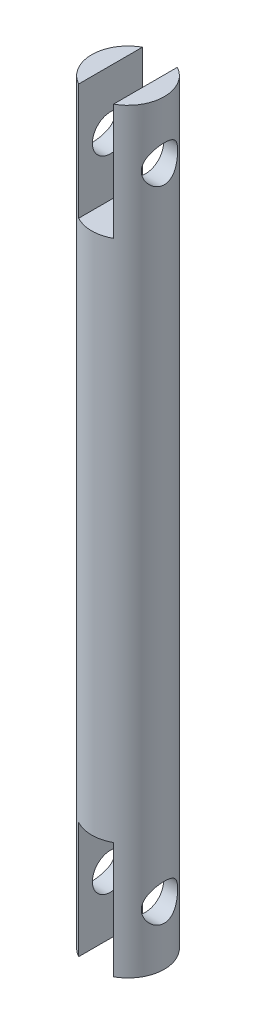
ISO-10303-21;
HEADER;
FILE_DESCRIPTION(('STEP AP214'),'2;1');
FILE_NAME('part.step','',(''),(''),'','','');
FILE_SCHEMA(('AUTOMOTIVE_DESIGN { 1 0 10303 214 1 1 1 1 }'));
ENDSEC;
DATA;
#1=APPLICATION_CONTEXT('core data for automotive mechanical design processes');
#2=APPLICATION_PROTOCOL_DEFINITION('international standard','automotive_design',2000,#1);
#3=PRODUCT_CONTEXT('',#1,'mechanical');
#4=PRODUCT('Part','Part','',(#3));
#5=PRODUCT_RELATED_PRODUCT_CATEGORY('part','',(#4));
#6=PRODUCT_DEFINITION_FORMATION('','',#4);
#7=PRODUCT_DEFINITION_CONTEXT('part definition',#1,'design');
#8=PRODUCT_DEFINITION('design','',#6,#7);
#9=PRODUCT_DEFINITION_SHAPE('','',#8);
#10=(LENGTH_UNIT() NAMED_UNIT(*) SI_UNIT(.MILLI.,.METRE.));
#11=(NAMED_UNIT(*) PLANE_ANGLE_UNIT() SI_UNIT($,.RADIAN.));
#12=(NAMED_UNIT(*) SI_UNIT($,.STERADIAN.) SOLID_ANGLE_UNIT());
#13=UNCERTAINTY_MEASURE_WITH_UNIT(LENGTH_MEASURE(1.E-05),#10,'distance_accuracy_value','');
#14=(GEOMETRIC_REPRESENTATION_CONTEXT(3) GLOBAL_UNCERTAINTY_ASSIGNED_CONTEXT((#13)) GLOBAL_UNIT_ASSIGNED_CONTEXT((#10,
#11,#12)) REPRESENTATION_CONTEXT('',''));
#15=CARTESIAN_POINT('',(0.,0.,0.));
#16=DIRECTION('',(0.,0.,1.));
#17=DIRECTION('',(1.,0.,0.));
#18=AXIS2_PLACEMENT_3D('',#15,#16,#17);
#19=CARTESIAN_POINT('',(0.,52.,0.));
#20=DIRECTION('',(0.,1.,0.));
#21=DIRECTION('',(0.,0.,1.));
#22=AXIS2_PLACEMENT_3D('',#19,#20,#21);
#23=PLANE('',#22);
#24=DIRECTION('',(0.,0.,1.));
#25=VECTOR('',#24,1.);
#26=CARTESIAN_POINT('',(-1.2,52.,-2.5));
#27=LINE('',#26,#25);
#28=CARTESIAN_POINT('',(-1.2,52.,-2.19317121994613));
#29=VERTEX_POINT('',#28);
#30=CARTESIAN_POINT('',(-1.2,52.,2.19317121994613));
#31=VERTEX_POINT('',#30);
#32=EDGE_CURVE('E122',#29,#31,#27,.T.);
#33=ORIENTED_EDGE('',*,*,#32,.F.);
#34=CARTESIAN_POINT('',(0.,52.,0.));
#35=DIRECTION('',(0.,1.,0.));
#36=DIRECTION('',(0.,0.,1.));
#37=AXIS2_PLACEMENT_3D('',#34,#35,#36);
#38=CIRCLE('',#37,2.5);
#39=EDGE_CURVE('E134',#29,#31,#38,.T.);
#40=ORIENTED_EDGE('',*,*,#39,.T.);
#41=EDGE_LOOP('',(#33,#40));
#42=FACE_BOUND('',#41,.T.);
#43=ADVANCED_FACE('F45',(#42),#23,.T.);
#44=CARTESIAN_POINT('',(-2.5,48.,0.));
#45=DIRECTION('',(1.,0.,0.));
#46=DIRECTION('',(0.,0.,-1.));
#47=AXIS2_PLACEMENT_3D('',#44,#45,#46);
#48=CYLINDRICAL_SURFACE('',#47,1.25);
#49=CARTESIAN_POINT('',(-1.2,48.,0.));
#50=DIRECTION('',(-1.,0.,0.));
#51=DIRECTION('',(0.,0.,1.));
#52=AXIS2_PLACEMENT_3D('',#49,#50,#51);
#53=CIRCLE('',#52,1.25);
#54=CARTESIAN_POINT('',(-1.2,48.,1.25));
#55=VERTEX_POINT('',#54);
#56=EDGE_CURVE('E227',#55,#55,#53,.F.);
#57=ORIENTED_EDGE('',*,*,#56,.T.);
#58=EDGE_LOOP('',(#57));
#59=FACE_BOUND('',#58,.T.);
#60=CARTESIAN_POINT('',(-2.5,46.75,0.));
#61=CARTESIAN_POINT('',(-2.49999641755189,46.7500041278994,-0.0657149536912329));
#62=CARTESIAN_POINT('',(-2.49738113774397,46.7552125914021,-0.131508249622541));
#63=CARTESIAN_POINT('',(-2.48717695046745,46.7758161004261,-0.261150294085531));
#64=CARTESIAN_POINT('',(-2.47957859786229,46.7912304912471,-0.324995108391879));
#65=CARTESIAN_POINT('',(-2.46020349254139,46.831492260771,-0.448666931100718));
#66=CARTESIAN_POINT('',(-2.448442989719,46.85630298031,-0.508508503673975));
#67=CARTESIAN_POINT('',(-2.42182220644723,46.9144632767062,-0.623090771008206));
#68=CARTESIAN_POINT('',(-2.40696217041913,46.9478121803111,-0.677831867487562));
#69=CARTESIAN_POINT('',(-2.37445322822571,47.0243965618566,-0.784384772202396));
#70=CARTESIAN_POINT('',(-2.3566899890942,47.0681080990496,-0.835819013902634));
#71=CARTESIAN_POINT('',(-2.32074962808431,47.1631518490588,-0.930974306083716));
#72=CARTESIAN_POINT('',(-2.30257220261294,47.2144898147155,-0.974689478883455));
#73=CARTESIAN_POINT('',(-2.26623688996684,47.3281041869042,-1.05656500056285));
#74=CARTESIAN_POINT('',(-2.24818983712665,47.3909201229324,-1.09403166943955));
#75=CARTESIAN_POINT('',(-2.21607473465401,47.5229591699828,-1.15771028361337));
#76=CARTESIAN_POINT('',(-2.20200384508737,47.5921776609034,-1.18393026870792));
#77=CARTESIAN_POINT('',(-2.18072333797261,47.7308313817774,-1.22266555273573));
#78=CARTESIAN_POINT('',(-2.17315339479642,47.8000055650842,-1.23590732135055));
#79=CARTESIAN_POINT('',(-2.1647736243566,47.9399735472244,-1.25053374163606));
#80=CARTESIAN_POINT('',(-2.1639571167911,48.0107656760889,-1.25193011046634));
#81=CARTESIAN_POINT('',(-2.16888662821561,48.1428575303942,-1.24335910896537));
#82=CARTESIAN_POINT('',(-2.17385954577517,48.2042800390288,-1.23473069942102));
#83=CARTESIAN_POINT('',(-2.18845285917313,48.3246523867163,-1.20867481132116));
#84=CARTESIAN_POINT('',(-2.1980747353972,48.3836014316316,-1.19124452987206));
#85=CARTESIAN_POINT('',(-2.22109345515926,48.4990364157071,-1.1477622254825));
#86=CARTESIAN_POINT('',(-2.23457300829998,48.5554329984822,-1.12151883389499));
#87=CARTESIAN_POINT('',(-2.26379255351755,48.6632928657375,-1.061302109585));
#88=CARTESIAN_POINT('',(-2.27953355975238,48.7147539195001,-1.02732530476558));
#89=CARTESIAN_POINT('',(-2.31391447379107,48.818151565929,-0.947582568640984));
#90=CARTESIAN_POINT('',(-2.33266887795933,48.8693210919702,-0.9008680729616));
#91=CARTESIAN_POINT('',(-2.36934529125509,48.9634192732386,-0.799444473426714));
#92=CARTESIAN_POINT('',(-2.38726689948501,49.0063439900424,-0.744731570717854));
#93=CARTESIAN_POINT('',(-2.42127484103705,49.0846070762872,-0.625645632289809));
#94=CARTESIAN_POINT('',(-2.43723730202509,49.1195005905572,-0.56094198949926));
#95=CARTESIAN_POINT('',(-2.46447351401553,49.1776212863038,-0.425582769360996));
#96=CARTESIAN_POINT('',(-2.47575098679441,49.200857731269,-0.354931970331595));
#97=CARTESIAN_POINT('',(-2.49155417176795,49.2330942546458,-0.215958114575876));
#98=CARTESIAN_POINT('',(-2.4965617287664,49.2431140446835,-0.147926913185405));
#99=CARTESIAN_POINT('',(-2.50091266823877,49.2518309139181,-0.0109744999366913));
#100=CARTESIAN_POINT('',(-2.5002587340164,49.2505333570493,0.0579462748373776));
#101=CARTESIAN_POINT('',(-2.49363990316801,49.2372416394766,0.189041214982493));
#102=CARTESIAN_POINT('',(-2.48809057110237,49.2260843340875,0.251324260062444));
#103=CARTESIAN_POINT('',(-2.47277714143524,49.1947024101311,0.373008615377397));
#104=CARTESIAN_POINT('',(-2.46301257917916,49.1744767919333,0.432409607113746));
#105=CARTESIAN_POINT('',(-2.43980314267087,49.1250019169585,0.548610760562083));
#106=CARTESIAN_POINT('',(-2.42626102212424,49.095511187354,0.605287996257694));
#107=CARTESIAN_POINT('',(-2.39679967896386,49.0286155804424,0.713076702123653));
#108=CARTESIAN_POINT('',(-2.38087944457231,48.9912073317582,0.764185787219102));
#109=CARTESIAN_POINT('',(-2.34635276671831,48.9052994683339,0.864709611613315));
#110=CARTESIAN_POINT('',(-2.32763606060552,48.856071414433,0.913465097280797));
#111=CARTESIAN_POINT('',(-2.29077989504843,48.7500935609134,1.00232040139155));
#112=CARTESIAN_POINT('',(-2.27264084226908,48.6933386014795,1.04241423211355));
#113=CARTESIAN_POINT('',(-2.23813990282585,48.5704454322496,1.11463489312212));
#114=CARTESIAN_POINT('',(-2.2219066207934,48.5039859172393,1.14628186984829));
#115=CARTESIAN_POINT('',(-2.19467590460158,48.3656124153843,1.19760353251725));
#116=CARTESIAN_POINT('',(-2.18367172800773,48.2937055918735,1.21729364485946));
#117=CARTESIAN_POINT('',(-2.16951876260834,48.1538622214232,1.2423271093121));
#118=CARTESIAN_POINT('',(-2.16571729325614,48.0862071832137,1.24886624550108));
#119=CARTESIAN_POINT('',(-2.16456693307719,47.9506911660366,1.25086144297598));
#120=CARTESIAN_POINT('',(-2.16721524534441,47.8828302890757,1.2463223082805));
#121=CARTESIAN_POINT('',(-2.17797327562531,47.755645623085,1.22740765699033));
#122=CARTESIAN_POINT('',(-2.18553868102992,47.6961244123195,1.2140103929285));
#123=CARTESIAN_POINT('',(-2.20463770234897,47.5802398507191,1.1789691977808));
#124=CARTESIAN_POINT('',(-2.21617259462095,47.523877522385,1.15732261394976));
#125=CARTESIAN_POINT('',(-2.2428566295566,47.4117189362667,1.10476968162585));
#126=CARTESIAN_POINT('',(-2.25819652995238,47.3562151227129,1.07333892227057));
#127=CARTESIAN_POINT('',(-2.29044164543238,47.2509068297743,1.00268871454579));
#128=CARTESIAN_POINT('',(-2.30734767243153,47.2011053368519,0.963465214048306));
#129=CARTESIAN_POINT('',(-2.34327903949141,47.102322522053,0.872754158330797));
#130=CARTESIAN_POINT('',(-2.36231229139336,47.0541761220476,0.820355528762708));
#131=CARTESIAN_POINT('',(-2.3984719031886,46.9671712707205,0.707693507775343));
#132=CARTESIAN_POINT('',(-2.4155972326005,46.9283178257171,0.647425904070976));
#133=CARTESIAN_POINT('',(-2.44622511981379,46.8609545465472,0.519914496024928));
#134=CARTESIAN_POINT('',(-2.45970120703636,46.8325197882357,0.452624379918262));
#135=CARTESIAN_POINT('',(-2.48126676704332,46.7877397901013,0.313427626617734));
#136=CARTESIAN_POINT('',(-2.48937154216165,46.771360191463,0.241534749528954));
#137=CARTESIAN_POINT('',(-2.49619327387079,46.7576282361552,0.140752433104227));
#138=CARTESIAN_POINT('',(-2.49761706674002,46.7547716989205,0.112702349299371));
#139=CARTESIAN_POINT('',(-2.49952121222331,46.750956668104,0.0564396647589457));
#140=CARTESIAN_POINT('',(-2.50000153879704,46.749998226911,0.0282270595592261));
#141=CARTESIAN_POINT('',(-2.5,46.75,0.));
#142=B_SPLINE_CURVE_WITH_KNOTS('',3,(#60,#61,#62,#63,#64,#65,#66,#67,#68,#69,#70,#71,#72,#73,
#74,#75,#76,#77,#78,#79,#80,#81,#82,#83,#84,#85,#86,#87,#88,#89,#90,#91,#92,#93,#94,#95,#96,#97,
#98,#99,#100,#101,#102,#103,#104,#105,#106,#107,#108,#109,#110,#111,#112,#113,#114,#115,#116,
#117,#118,#119,#120,#121,#122,#123,#124,#125,#126,#127,#128,#129,#130,#131,#132,#133,#134,#135,
#136,#137,#138,#139,#140,#141),.UNSPECIFIED.,.T.,.F.,(4,2,2,2,2,2,2,2,2,2,2,2,2,2,2,2,2,2,2,2,2,
2,2,2,2,2,2,2,2,2,2,2,2,2,2,2,2,2,2,2,4),(0.,0.197030321775365,0.394435187136497,
0.591077694365375,0.787704700726956,0.9962271983976,1.20490779706754,1.42977158038441,
1.65447434872851,1.86572515175287,2.07676696661275,2.2625714051165,2.44843504907097,
2.63862800210609,2.82890651575277,3.04331176667347,3.25781918248357,3.4822877776805,
3.70657771140349,3.91229113089181,4.11790705639344,4.30758633132651,4.49728652038664,
4.69241070034873,4.88761813435423,5.10199513305522,5.31651985769288,5.54143352699591,
5.76605639925971,5.96911634372966,6.17208824825005,6.35572412805227,6.53941910979597,
6.73545570969517,6.93159451423696,7.15156553440622,7.37165479220715,7.59330017078655,
7.81431135781161,7.8989410017212,7.98357298143557),.UNSPECIFIED.);
#143=CARTESIAN_POINT('',(-2.5,46.75,0.));
#144=VERTEX_POINT('',#143);
#145=EDGE_CURVE('E170',#144,#144,#142,.T.);
#146=ORIENTED_EDGE('',*,*,#145,.F.);
#147=EDGE_LOOP('',(#146));
#148=FACE_BOUND('',#147,.T.);
#149=ADVANCED_FACE('F183',(#59,#148),#48,.F.);
#150=CARTESIAN_POINT('',(0.,52.,0.));
#151=DIRECTION('',(0.,-1.,0.));
#152=DIRECTION('',(0.,0.,-1.));
#153=AXIS2_PLACEMENT_3D('',#150,#151,#152);
#154=CYLINDRICAL_SURFACE('',#153,2.5);
#155=CARTESIAN_POINT('',(0.,44.,0.));
#156=DIRECTION('',(0.,-1.,0.));
#157=DIRECTION('',(0.,0.,-1.));
#158=AXIS2_PLACEMENT_3D('',#155,#156,#157);
#159=CIRCLE('',#158,2.5);
#160=CARTESIAN_POINT('',(1.2,44.,2.19317121994613));
#161=VERTEX_POINT('',#160);
#162=CARTESIAN_POINT('',(-1.2,44.,2.19317121994613));
#163=VERTEX_POINT('',#162);
#164=EDGE_CURVE('E11',#161,#163,#159,.T.);
#165=ORIENTED_EDGE('',*,*,#164,.T.);
#166=DIRECTION('',(0.,-1.,0.));
#167=VECTOR('',#166,1.);
#168=CARTESIAN_POINT('',(-1.2,52.,2.19317121994613));
#169=LINE('',#168,#167);
#170=EDGE_CURVE('E223',#163,#31,#169,.F.);
#171=ORIENTED_EDGE('',*,*,#170,.T.);
#172=ORIENTED_EDGE('',*,*,#39,.F.);
#173=DIRECTION('',(0.,-1.,0.));
#174=VECTOR('',#173,1.);
#175=CARTESIAN_POINT('',(-1.2,52.,-2.19317121994613));
#176=LINE('',#175,#174);
#177=CARTESIAN_POINT('',(-1.2,44.,-2.19317121994613));
#178=VERTEX_POINT('',#177);
#179=EDGE_CURVE('E161',#29,#178,#176,.T.);
#180=ORIENTED_EDGE('',*,*,#179,.T.);
#181=CARTESIAN_POINT('',(1.2,44.,-2.19317121994613));
#182=VERTEX_POINT('',#181);
#183=EDGE_CURVE('E50',#178,#182,#159,.T.);
#184=ORIENTED_EDGE('',*,*,#183,.T.);
#185=DIRECTION('',(0.,-1.,0.));
#186=VECTOR('',#185,1.);
#187=CARTESIAN_POINT('',(1.2,52.,-2.19317121994613));
#188=LINE('',#187,#186);
#189=CARTESIAN_POINT('',(1.2,52.,-2.19317121994613));
#190=VERTEX_POINT('',#189);
#191=EDGE_CURVE('E115',#182,#190,#188,.F.);
#192=ORIENTED_EDGE('',*,*,#191,.T.);
#193=CARTESIAN_POINT('',(1.2,52.,2.19317121994613));
#194=VERTEX_POINT('',#193);
#195=EDGE_CURVE('E126',#194,#190,#38,.T.);
#196=ORIENTED_EDGE('',*,*,#195,.F.);
#197=DIRECTION('',(0.,-1.,0.));
#198=VECTOR('',#197,1.);
#199=CARTESIAN_POINT('',(1.2,52.,2.19317121994613));
#200=LINE('',#199,#198);
#201=EDGE_CURVE('E62',#194,#161,#200,.T.);
#202=ORIENTED_EDGE('',*,*,#201,.T.);
#203=EDGE_LOOP('',(#165,#171,#172,#180,#184,#192,#196,#202));
#204=FACE_BOUND('',#203,.T.);
#205=CARTESIAN_POINT('',(-2.5,2.75,0.));
#206=CARTESIAN_POINT('',(-2.49999641755189,2.75000412789938,-0.0657149536912331));
#207=CARTESIAN_POINT('',(-2.49738113774397,2.75521259140209,-0.131508249622541));
#208=CARTESIAN_POINT('',(-2.48717695046745,2.77581610042615,-0.261150294085532));
#209=CARTESIAN_POINT('',(-2.47957859786229,2.79123049124706,-0.32499510839188));
#210=CARTESIAN_POINT('',(-2.46020349254139,2.83149226077099,-0.448666931100718));
#211=CARTESIAN_POINT('',(-2.448442989719,2.85630298031002,-0.508508503673975));
#212=CARTESIAN_POINT('',(-2.42182220644723,2.91446327670618,-0.623090771008207));
#213=CARTESIAN_POINT('',(-2.40696217041912,2.94781218031107,-0.677831867487563));
#214=CARTESIAN_POINT('',(-2.37445322822571,3.02439656185662,-0.784384772202399));
#215=CARTESIAN_POINT('',(-2.3566899890942,3.06810809904955,-0.835819013902641));
#216=CARTESIAN_POINT('',(-2.3207496280843,3.16315184905879,-0.930974306083722));
#217=CARTESIAN_POINT('',(-2.30257220261294,3.21448981471555,-0.974689478883458));
#218=CARTESIAN_POINT('',(-2.26623688996684,3.32810418690423,-1.05656500056285));
#219=CARTESIAN_POINT('',(-2.24818983712665,3.39092012293239,-1.09403166943955));
#220=CARTESIAN_POINT('',(-2.21607473465401,3.52295916998277,-1.15771028361337));
#221=CARTESIAN_POINT('',(-2.20200384508737,3.59217766090344,-1.18393026870792));
#222=CARTESIAN_POINT('',(-2.18072333797261,3.7308313817774,-1.22266555273573));
#223=CARTESIAN_POINT('',(-2.17315339479642,3.80000556508424,-1.23590732135055));
#224=CARTESIAN_POINT('',(-2.1647736243566,3.93997354722434,-1.25053374163606));
#225=CARTESIAN_POINT('',(-2.1639571167911,4.01076567608894,-1.25193011046634));
#226=CARTESIAN_POINT('',(-2.16888662821561,4.14285753039421,-1.24335910896537));
#227=CARTESIAN_POINT('',(-2.17385954577517,4.20428003902881,-1.23473069942103));
#228=CARTESIAN_POINT('',(-2.18845285917313,4.3246523867163,-1.20867481132117));
#229=CARTESIAN_POINT('',(-2.1980747353972,4.38360143163164,-1.19124452987206));
#230=CARTESIAN_POINT('',(-2.22109345515926,4.49903641570707,-1.1477622254825));
#231=CARTESIAN_POINT('',(-2.23457300829998,4.55543299848223,-1.12151883389499));
#232=CARTESIAN_POINT('',(-2.26379255351755,4.66329286573751,-1.061302109585));
#233=CARTESIAN_POINT('',(-2.27953355975238,4.71475391950011,-1.02732530476558));
#234=CARTESIAN_POINT('',(-2.31391447379107,4.81815156592903,-0.947582568640986));
#235=CARTESIAN_POINT('',(-2.33266887795933,4.8693210919702,-0.900868072961602));
#236=CARTESIAN_POINT('',(-2.36934529125509,4.96341927323863,-0.799444473426716));
#237=CARTESIAN_POINT('',(-2.38726689948501,5.00634399004235,-0.744731570717856));
#238=CARTESIAN_POINT('',(-2.42127484103705,5.08460707628716,-0.625645632289809));
#239=CARTESIAN_POINT('',(-2.43723730202509,5.11950059055718,-0.56094198949926));
#240=CARTESIAN_POINT('',(-2.46447351401553,5.17762128630376,-0.425582769360995));
#241=CARTESIAN_POINT('',(-2.47575098679441,5.20085773126896,-0.354931970331594));
#242=CARTESIAN_POINT('',(-2.49155417176795,5.23309425464584,-0.215958114575876));
#243=CARTESIAN_POINT('',(-2.4965617287664,5.24311404468347,-0.147926913185404));
#244=CARTESIAN_POINT('',(-2.50091266823877,5.25183091391811,-0.0109744999366911));
#245=CARTESIAN_POINT('',(-2.5002587340164,5.25053335704935,0.0579462748373775));
#246=CARTESIAN_POINT('',(-2.49363990316801,5.23724163947656,0.189041214982492));
#247=CARTESIAN_POINT('',(-2.48809057110237,5.22608433408746,0.251324260062443));
#248=CARTESIAN_POINT('',(-2.47277714143524,5.19470241013114,0.373008615377396));
#249=CARTESIAN_POINT('',(-2.46301257917916,5.1744767919333,0.432409607113746));
#250=CARTESIAN_POINT('',(-2.43980314267087,5.12500191695853,0.548610760562081));
#251=CARTESIAN_POINT('',(-2.42626102212424,5.09551118735398,0.605287996257691));
#252=CARTESIAN_POINT('',(-2.39679967896386,5.02861558044245,0.71307670212365));
#253=CARTESIAN_POINT('',(-2.38087944457231,4.99120733175821,0.764185787219102));
#254=CARTESIAN_POINT('',(-2.34635276671831,4.90529946833391,0.864709611613316));
#255=CARTESIAN_POINT('',(-2.32763606060552,4.85607141443304,0.913465097280798));
#256=CARTESIAN_POINT('',(-2.29077989504843,4.75009356091337,1.00232040139155));
#257=CARTESIAN_POINT('',(-2.27264084226908,4.69333860147953,1.04241423211355));
#258=CARTESIAN_POINT('',(-2.23813990282585,4.57044543224961,1.11463489312212));
#259=CARTESIAN_POINT('',(-2.2219066207934,4.50398591723926,1.1462818698483));
#260=CARTESIAN_POINT('',(-2.19467590460158,4.36561241538435,1.19760353251725));
#261=CARTESIAN_POINT('',(-2.18367172800773,4.29370559187352,1.21729364485946));
#262=CARTESIAN_POINT('',(-2.16951876260833,4.15386222142319,1.2423271093121));
#263=CARTESIAN_POINT('',(-2.16571729325614,4.0862071832137,1.24886624550108));
#264=CARTESIAN_POINT('',(-2.16456693307719,3.95069116603659,1.25086144297598));
#265=CARTESIAN_POINT('',(-2.16721524534441,3.88283028907571,1.2463223082805));
#266=CARTESIAN_POINT('',(-2.17797327562531,3.75564562308498,1.22740765699033));
#267=CARTESIAN_POINT('',(-2.18553868102992,3.6961244123195,1.2140103929285));
#268=CARTESIAN_POINT('',(-2.20463770234897,3.58023985071912,1.17896919778081));
#269=CARTESIAN_POINT('',(-2.21617259462095,3.52387752238504,1.15732261394976));
#270=CARTESIAN_POINT('',(-2.2428566295566,3.41171893626674,1.10476968162585));
#271=CARTESIAN_POINT('',(-2.25819652995238,3.35621512271287,1.07333892227057));
#272=CARTESIAN_POINT('',(-2.29044164543238,3.25090682977427,1.00268871454579));
#273=CARTESIAN_POINT('',(-2.30734767243153,3.20110533685189,0.963465214048309));
#274=CARTESIAN_POINT('',(-2.34327903949141,3.10232252205298,0.8727541583308));
#275=CARTESIAN_POINT('',(-2.36231229139336,3.0541761220476,0.820355528762712));
#276=CARTESIAN_POINT('',(-2.3984719031886,2.96717127072046,0.707693507775348));
#277=CARTESIAN_POINT('',(-2.4155972326005,2.92831782571714,0.64742590407098));
#278=CARTESIAN_POINT('',(-2.44622511981379,2.86095454654725,0.519914496024933));
#279=CARTESIAN_POINT('',(-2.45970120703636,2.83251978823571,0.452624379918268));
#280=CARTESIAN_POINT('',(-2.48126676704332,2.78773979010131,0.313427626617739));
#281=CARTESIAN_POINT('',(-2.48937154216165,2.77136019146303,0.241534749528957));
#282=CARTESIAN_POINT('',(-2.49619327387079,2.75762823615519,0.140752433104229));
#283=CARTESIAN_POINT('',(-2.49761706674002,2.75477169892048,0.112702349299373));
#284=CARTESIAN_POINT('',(-2.49952121222331,2.75095666810399,0.0564396647589469));
#285=CARTESIAN_POINT('',(-2.50000153879704,2.749998226911,0.0282270595592267));
#286=CARTESIAN_POINT('',(-2.5,2.75,0.));
#287=B_SPLINE_CURVE_WITH_KNOTS('',3,(#205,#206,#207,#208,#209,#210,#211,#212,#213,#214,#215,
#216,#217,#218,#219,#220,#221,#222,#223,#224,#225,#226,#227,#228,#229,#230,#231,#232,#233,#234,
#235,#236,#237,#238,#239,#240,#241,#242,#243,#244,#245,#246,#247,#248,#249,#250,#251,#252,#253,
#254,#255,#256,#257,#258,#259,#260,#261,#262,#263,#264,#265,#266,#267,#268,#269,#270,#271,#272,
#273,#274,#275,#276,#277,#278,#279,#280,#281,#282,#283,#284,#285,#286),.UNSPECIFIED.,.T.,.F.,(4,
2,2,2,2,2,2,2,2,2,2,2,2,2,2,2,2,2,2,2,2,2,2,2,2,2,2,2,2,2,2,2,2,2,2,2,2,2,2,2,4),(0.,
0.197030321775366,0.394435187136497,0.591077694365373,0.78770470072696,0.996227198397612,
1.20490779706755,1.42977158038441,1.65447434872851,1.86572515175287,2.07676696661275,
2.2625714051165,2.44843504907098,2.63862800210609,2.82890651575277,3.04331176667348,
3.25781918248358,3.48228777768051,3.70657771140349,3.91229113089182,4.11790705639345,
4.30758633132652,4.49728652038664,4.69241070034873,4.88761813435424,5.10199513305523,
5.31651985769289,5.54143352699592,5.76605639925972,5.96911634372967,6.17208824825007,
6.35572412805228,6.53941910979597,6.73545570969517,6.93159451423697,7.15156553440623,
7.37165479220716,7.59330017078656,7.81431135781162,7.89894100172122,7.98357298143558),.UNSPECIFIED.);
#288=CARTESIAN_POINT('',(-2.5,2.75,0.));
#289=VERTEX_POINT('',#288);
#290=EDGE_CURVE('E245',#289,#289,#287,.T.);
#291=ORIENTED_EDGE('',*,*,#290,.T.);
#292=EDGE_LOOP('',(#291));
#293=FACE_BOUND('',#292,.T.);
#294=CARTESIAN_POINT('',(2.1650635094611,4.,-1.25));
#295=CARTESIAN_POINT('',(2.16506918410574,3.93486523975594,-1.24999545384316));
#296=CARTESIAN_POINT('',(2.16804751484696,3.86964823559369,-1.24487496341652));
#297=CARTESIAN_POINT('',(2.17952958065066,3.74121591915356,-1.22465401237257));
#298=CARTESIAN_POINT('',(2.18804492569449,3.67800510619574,-1.20953258069272));
#299=CARTESIAN_POINT('',(2.20936683256748,3.55568541957007,-1.17012493587476));
#300=CARTESIAN_POINT('',(2.22215054341565,3.49655668440802,-1.14588744061716));
#301=CARTESIAN_POINT('',(2.25053331021072,3.3832197475041,-1.08908440672047));
#302=CARTESIAN_POINT('',(2.26613251845081,3.32901181217193,-1.05651841754472));
#303=CARTESIAN_POINT('',(2.29996086321802,3.22211783930312,-0.980833175663599));
#304=CARTESIAN_POINT('',(2.31830079547442,3.16992608040807,-0.937065045179714));
#305=CARTESIAN_POINT('',(2.35464978482132,3.07323951449162,-0.841567259518087));
#306=CARTESIAN_POINT('',(2.37265867289062,3.0287485467706,-0.789833657227868));
#307=CARTESIAN_POINT('',(2.40776846191186,2.94579106106542,-0.675611954268185));
#308=CARTESIAN_POINT('',(2.42472633022716,2.90793279017559,-0.612633986265721));
#309=CARTESIAN_POINT('',(2.45438445124411,2.8435739334428,-0.480196283249383));
#310=CARTESIAN_POINT('',(2.46708738979677,2.81706617982854,-0.410740672672698));
#311=CARTESIAN_POINT('',(2.48600576555297,2.77811917337363,-0.272556179907475));
#312=CARTESIAN_POINT('',(2.49261850276115,2.76481309205559,-0.204127238111026));
#313=CARTESIAN_POINT('',(2.50009479807584,2.7497923516562,-0.0657132858723139));
#314=CARTESIAN_POINT('',(2.50096183480737,2.74807067900536,0.00427075730466945));
#315=CARTESIAN_POINT('',(2.49703727395563,2.75593334246294,0.137290655529684));
#316=CARTESIAN_POINT('',(2.49273119865201,2.76454751940153,0.200401498970986));
#317=CARTESIAN_POINT('',(2.47967806574684,2.79110105488082,0.3241422148979));
#318=CARTESIAN_POINT('',(2.47093067582992,2.80904111122028,0.384771901367404));
#319=CARTESIAN_POINT('',(2.44964479109568,2.85385320761227,0.50288673946194));
#320=CARTESIAN_POINT('',(2.43705551911499,2.88084539146508,0.560316779393971));
#321=CARTESIAN_POINT('',(2.40922057483359,2.94282927025187,0.669971001891658));
#322=CARTESIAN_POINT('',(2.39397395196855,2.97782382912794,0.722193311048305));
#323=CARTESIAN_POINT('',(2.36055492999037,3.05861918941627,0.825217076122742));
#324=CARTESIAN_POINT('',(2.34224219997719,3.10512878540751,0.875417593786699));
#325=CARTESIAN_POINT('',(2.30567925733515,3.20573715616272,0.967630462872223));
#326=CARTESIAN_POINT('',(2.28742910332036,3.25984171534258,1.00963651446779));
#327=CARTESIAN_POINT('',(2.25180195115606,3.37831024053011,1.08688166830276));
#328=CARTESIAN_POINT('',(2.23455399988385,3.44310752881776,1.12152164372256));
#329=CARTESIAN_POINT('',(2.2046931284822,3.57867208919875,1.17914889125154));
#330=CARTESIAN_POINT('',(2.19207537557584,3.64943304127195,1.20214832276361));
#331=CARTESIAN_POINT('',(2.17430794771293,3.78901813910349,1.2339752637813));
#332=CARTESIAN_POINT('',(2.16864569810621,3.85755139880444,1.24378140264997));
#333=CARTESIAN_POINT('',(2.16397399202012,3.99550167689567,1.25189618326428));
#334=CARTESIAN_POINT('',(2.1649598361164,4.06491803639973,1.25021294664378));
#335=CARTESIAN_POINT('',(2.17292920675731,4.19456739822341,1.23629505417996));
#336=CARTESIAN_POINT('',(2.17924484383318,4.2549743138849,1.22523477089058));
#337=CARTESIAN_POINT('',(2.19617526939176,4.37295973283869,1.19462035579055));
#338=CARTESIAN_POINT('',(2.20679145006292,4.43053731343326,1.17506347327952));
#339=CARTESIAN_POINT('',(2.23170277599571,4.54426416362837,1.12705948575611));
#340=CARTESIAN_POINT('',(2.24614554053829,4.60022377106694,1.09824257961591));
#341=CARTESIAN_POINT('',(2.27695149371562,4.70683658942374,1.03285883001976));
#342=CARTESIAN_POINT('',(2.29331566693934,4.7574870543916,0.996288005415272));
#343=CARTESIAN_POINT('',(2.3285999807042,4.85872345940443,0.911046458998569));
#344=CARTESIAN_POINT('',(2.34758228942861,4.90849643839707,0.86143159039371));
#345=CARTESIAN_POINT('',(2.38417793722366,4.99926529749199,0.754255619247862));
#346=CARTESIAN_POINT('',(2.40179081259637,5.04025821278817,0.696691843319186));
#347=CARTESIAN_POINT('',(2.43426702113696,5.11321715743763,0.573169203198449));
#348=CARTESIAN_POINT('',(2.44904552090036,5.14491639776364,0.507028871967643));
#349=CARTESIAN_POINT('',(2.47354193699126,5.19642237982174,0.369402955801354));
#350=CARTESIAN_POINT('',(2.48326429595466,5.21623956420788,0.297922126740222));
#351=CARTESIAN_POINT('',(2.49584385227353,5.24171070521833,0.158724602913023));
#352=CARTESIAN_POINT('',(2.49924909885239,5.24849734484514,0.0912643048130729));
#353=CARTESIAN_POINT('',(2.50052662968914,5.251054081818,-0.0439074824390028));
#354=CARTESIAN_POINT('',(2.49840085083612,5.24682803565445,-0.111618875368857));
#355=CARTESIAN_POINT('',(2.48917461047403,5.22822949150547,-0.240672490396432));
#356=CARTESIAN_POINT('',(2.48241118334987,5.21454393842791,-0.302140397264078));
#357=CARTESIAN_POINT('',(2.46490117079279,5.17834125087129,-0.42180744022952));
#358=CARTESIAN_POINT('',(2.45415401415995,5.15582284988318,-0.480006106194384));
#359=CARTESIAN_POINT('',(2.4290741343515,5.10159118479253,-0.594279257806103));
#360=CARTESIAN_POINT('',(2.41460771498499,5.0695258459902,-0.650156428375055));
#361=CARTESIAN_POINT('',(2.38360166427283,4.99755258642619,-0.755968302267528));
#362=CARTESIAN_POINT('',(2.36706108197951,4.95764106360541,-0.805900259268631));
#363=CARTESIAN_POINT('',(2.33160762783285,4.86650357622162,-0.903642505196111));
#364=CARTESIAN_POINT('',(2.31262248764623,4.81454689065351,-0.950747105674087));
#365=CARTESIAN_POINT('',(2.27578845203566,4.70318659858779,-1.03582910924334));
#366=CARTESIAN_POINT('',(2.25794057202332,4.6437764739154,-1.07379843751257));
#367=CARTESIAN_POINT('',(2.22499506631145,4.51670419177381,-1.14053884973207));
#368=CARTESIAN_POINT('',(2.21000217820338,4.44884058608908,-1.16898133245117));
#369=CARTESIAN_POINT('',(2.1858269541044,4.30833449457528,-1.21359838688301));
#370=CARTESIAN_POINT('',(2.17662520184628,4.23570888885914,-1.22981398896918));
#371=CARTESIAN_POINT('',(2.16911590752238,4.13524330543501,-1.24295875983052));
#372=CARTESIAN_POINT('',(2.1676016125644,4.10829013200265,-1.24559513120481));
#373=CARTESIAN_POINT('',(2.16557419859688,4.0542293991472,-1.24911675636245));
#374=CARTESIAN_POINT('',(2.16506114656387,4.02712182951766,-1.25000189299984));
#375=CARTESIAN_POINT('',(2.1650635094611,4.,-1.25));
#376=B_SPLINE_CURVE_WITH_KNOTS('',3,(#294,#295,#296,#297,#298,#299,#300,#301,#302,#303,#304,
#305,#306,#307,#308,#309,#310,#311,#312,#313,#314,#315,#316,#317,#318,#319,#320,#321,#322,#323,
#324,#325,#326,#327,#328,#329,#330,#331,#332,#333,#334,#335,#336,#337,#338,#339,#340,#341,#342,
#343,#344,#345,#346,#347,#348,#349,#350,#351,#352,#353,#354,#355,#356,#357,#358,#359,#360,#361,
#362,#363,#364,#365,#366,#367,#368,#369,#370,#371,#372,#373,#374,#375),.UNSPECIFIED.,.T.,.F.,(4,
2,2,2,2,2,2,2,2,2,2,2,2,2,2,2,2,2,2,2,2,2,2,2,2,2,2,2,2,2,2,2,2,2,2,2,2,2,2,2,4),(0.,
0.195290153243394,0.390991116031005,0.585660744898606,0.780340906806435,0.991077890622789,
1.20191963855463,1.42697365298454,1.65188533704863,1.86079356209918,2.0695752960755,
2.26020121855672,2.45084140646818,2.64411918413933,2.83746624187839,3.04908989321113,
3.26087560307398,3.4861105216181,3.71110967764631,3.91827863567764,4.12530116485466,
4.30967729280031,4.49411315545078,4.68709120507609,4.88016857775058,5.09758429475766,
5.31507331222752,5.53830226766206,5.76133474760964,5.96390337986858,6.16640108492464,
6.35555531089365,6.54473666890015,6.74200938399339,6.93937287625898,7.15637802312583,
7.37357428556442,7.59763436298255,7.8209391625345,7.90225168981636,7.98356965618175),.UNSPECIFIED.);
#377=CARTESIAN_POINT('',(2.1650635094611,4.,-1.25));
#378=VERTEX_POINT('',#377);
#379=EDGE_CURVE('E238',#378,#378,#376,.T.);
#380=ORIENTED_EDGE('',*,*,#379,.T.);
#381=EDGE_LOOP('',(#380));
#382=FACE_BOUND('',#381,.T.);
#383=ORIENTED_EDGE('',*,*,#145,.T.);
#384=EDGE_LOOP('',(#383));
#385=FACE_BOUND('',#384,.T.);
#386=CARTESIAN_POINT('',(2.1650635094611,48.,-1.25));
#387=CARTESIAN_POINT('',(2.16506918410574,47.9348652397559,-1.24999545384316));
#388=CARTESIAN_POINT('',(2.16804751484696,47.8696482355937,-1.24487496341652));
#389=CARTESIAN_POINT('',(2.17952958065066,47.7412159191536,-1.22465401237257));
#390=CARTESIAN_POINT('',(2.18804492569449,47.6780051061957,-1.20953258069272));
#391=CARTESIAN_POINT('',(2.20936683256748,47.5556854195701,-1.17012493587476));
#392=CARTESIAN_POINT('',(2.22215054341565,47.496556684408,-1.14588744061716));
#393=CARTESIAN_POINT('',(2.25053331021072,47.3832197475041,-1.08908440672046));
#394=CARTESIAN_POINT('',(2.26613251845081,47.3290118121719,-1.05651841754471));
#395=CARTESIAN_POINT('',(2.29996086321802,47.2221178393031,-0.980833175663595));
#396=CARTESIAN_POINT('',(2.31830079547442,47.1699260804081,-0.93706504517971));
#397=CARTESIAN_POINT('',(2.35464978482132,47.0732395144916,-0.841567259518083));
#398=CARTESIAN_POINT('',(2.37265867289062,47.0287485467706,-0.789833657227865));
#399=CARTESIAN_POINT('',(2.40776846191186,46.9457910610654,-0.675611954268183));
#400=CARTESIAN_POINT('',(2.42472633022716,46.9079327901756,-0.61263398626572));
#401=CARTESIAN_POINT('',(2.45438445124411,46.8435739334428,-0.480196283249383));
#402=CARTESIAN_POINT('',(2.46708738979677,46.8170661798285,-0.410740672672697));
#403=CARTESIAN_POINT('',(2.48600576555297,46.7781191733736,-0.272556179907475));
#404=CARTESIAN_POINT('',(2.49261850276115,46.7648130920556,-0.204127238111025));
#405=CARTESIAN_POINT('',(2.50009479807584,46.7497923516562,-0.0657132858723139));
#406=CARTESIAN_POINT('',(2.50096183480737,46.7480706790054,0.00427075730466915));
#407=CARTESIAN_POINT('',(2.49703727395563,46.7559333424629,0.137290655529684));
#408=CARTESIAN_POINT('',(2.49273119865201,46.7645475194015,0.200401498970986));
#409=CARTESIAN_POINT('',(2.47967806574684,46.7911010548808,0.3241422148979));
#410=CARTESIAN_POINT('',(2.47093067582992,46.8090411112203,0.384771901367404));
#411=CARTESIAN_POINT('',(2.44964479109568,46.8538532076123,0.502886739461939));
#412=CARTESIAN_POINT('',(2.43705551911499,46.8808453914651,0.56031677939397));
#413=CARTESIAN_POINT('',(2.40922057483359,46.9428292702519,0.669971001891658));
#414=CARTESIAN_POINT('',(2.39397395196855,46.9778238291279,0.722193311048306));
#415=CARTESIAN_POINT('',(2.36055492999037,47.0586191894163,0.825217076122743));
#416=CARTESIAN_POINT('',(2.34224219997719,47.1051287854075,0.875417593786699));
#417=CARTESIAN_POINT('',(2.30567925733515,47.2057371561627,0.967630462872223));
#418=CARTESIAN_POINT('',(2.28742910332036,47.2598417153426,1.00963651446779));
#419=CARTESIAN_POINT('',(2.25180195115606,47.3783102405301,1.08688166830276));
#420=CARTESIAN_POINT('',(2.23455399988384,47.4431075288178,1.12152164372256));
#421=CARTESIAN_POINT('',(2.2046931284822,47.5786720891987,1.17914889125154));
#422=CARTESIAN_POINT('',(2.19207537557584,47.649433041272,1.20214832276361));
#423=CARTESIAN_POINT('',(2.17430794771293,47.7890181391035,1.2339752637813));
#424=CARTESIAN_POINT('',(2.16864569810621,47.8575513988044,1.24378140264997));
#425=CARTESIAN_POINT('',(2.16397399202012,47.9955016768957,1.25189618326428));
#426=CARTESIAN_POINT('',(2.1649598361164,48.0649180363997,1.25021294664378));
#427=CARTESIAN_POINT('',(2.17292920675731,48.1945673982234,1.23629505417996));
#428=CARTESIAN_POINT('',(2.17924484383318,48.2549743138849,1.22523477089058));
#429=CARTESIAN_POINT('',(2.19617526939176,48.3729597328387,1.19462035579055));
#430=CARTESIAN_POINT('',(2.20679145006292,48.4305373134333,1.17506347327952));
#431=CARTESIAN_POINT('',(2.23170277599571,48.5442641636284,1.12705948575611));
#432=CARTESIAN_POINT('',(2.24614554053829,48.6002237710669,1.0982425796159));
#433=CARTESIAN_POINT('',(2.27695149371562,48.7068365894237,1.03285883001976));
#434=CARTESIAN_POINT('',(2.29331566693934,48.7574870543916,0.996288005415271));
#435=CARTESIAN_POINT('',(2.3285999807042,48.8587234594044,0.911046458998568));
#436=CARTESIAN_POINT('',(2.34758228942861,48.9084964383971,0.86143159039371));
#437=CARTESIAN_POINT('',(2.38417793722365,48.999265297492,0.754255619247864));
#438=CARTESIAN_POINT('',(2.40179081259636,49.0402582127882,0.696691843319187));
#439=CARTESIAN_POINT('',(2.43426702113696,49.1132171574376,0.57316920319845));
#440=CARTESIAN_POINT('',(2.44904552090036,49.1449163977636,0.507028871967644));
#441=CARTESIAN_POINT('',(2.47354193699126,49.1964223798217,0.369402955801354));
#442=CARTESIAN_POINT('',(2.48326429595466,49.2162395642079,0.29792212674022));
#443=CARTESIAN_POINT('',(2.49584385227353,49.2417107052183,0.158724602913021));
#444=CARTESIAN_POINT('',(2.49924909885239,49.2484973448451,0.0912643048130715));
#445=CARTESIAN_POINT('',(2.50052662968914,49.251054081818,-0.0439074824390033));
#446=CARTESIAN_POINT('',(2.49840085083612,49.2468280356545,-0.111618875368857));
#447=CARTESIAN_POINT('',(2.48917461047403,49.2282294915055,-0.240672490396431));
#448=CARTESIAN_POINT('',(2.48241118334987,49.2145439384279,-0.302140397264077));
#449=CARTESIAN_POINT('',(2.46490117079279,49.1783412508713,-0.421807440229519));
#450=CARTESIAN_POINT('',(2.45415401415995,49.1558228498832,-0.480006106194384));
#451=CARTESIAN_POINT('',(2.4290741343515,49.1015911847925,-0.594279257806104));
#452=CARTESIAN_POINT('',(2.41460771498499,49.0695258459902,-0.650156428375056));
#453=CARTESIAN_POINT('',(2.38360166427283,48.9975525864262,-0.75596830226753));
#454=CARTESIAN_POINT('',(2.36706108197951,48.9576410636054,-0.805900259268633));
#455=CARTESIAN_POINT('',(2.33160762783285,48.8665035762216,-0.903642505196114));
#456=CARTESIAN_POINT('',(2.31262248764622,48.8145468906535,-0.95074710567409));
#457=CARTESIAN_POINT('',(2.27578845203565,48.7031865985878,-1.03582910924334));
#458=CARTESIAN_POINT('',(2.25794057202332,48.6437764739154,-1.07379843751257));
#459=CARTESIAN_POINT('',(2.22499506631145,48.5167041917738,-1.14053884973207));
#460=CARTESIAN_POINT('',(2.21000217820338,48.4488405860891,-1.16898133245117));
#461=CARTESIAN_POINT('',(2.1858269541044,48.3083344945753,-1.21359838688301));
#462=CARTESIAN_POINT('',(2.17662520184628,48.2357088888591,-1.22981398896918));
#463=CARTESIAN_POINT('',(2.16911590752238,48.135243305435,-1.24295875983052));
#464=CARTESIAN_POINT('',(2.1676016125644,48.1082901320026,-1.24559513120481));
#465=CARTESIAN_POINT('',(2.16557419859688,48.0542293991472,-1.24911675636245));
#466=CARTESIAN_POINT('',(2.16506114656387,48.0271218295177,-1.25000189299984));
#467=CARTESIAN_POINT('',(2.1650635094611,48.,-1.25));
#468=B_SPLINE_CURVE_WITH_KNOTS('',3,(#386,#387,#388,#389,#390,#391,#392,#393,#394,#395,#396,
#397,#398,#399,#400,#401,#402,#403,#404,#405,#406,#407,#408,#409,#410,#411,#412,#413,#414,#415,
#416,#417,#418,#419,#420,#421,#422,#423,#424,#425,#426,#427,#428,#429,#430,#431,#432,#433,#434,
#435,#436,#437,#438,#439,#440,#441,#442,#443,#444,#445,#446,#447,#448,#449,#450,#451,#452,#453,
#454,#455,#456,#457,#458,#459,#460,#461,#462,#463,#464,#465,#466,#467),.UNSPECIFIED.,.T.,.F.,(4,
2,2,2,2,2,2,2,2,2,2,2,2,2,2,2,2,2,2,2,2,2,2,2,2,2,2,2,2,2,2,2,2,2,2,2,2,2,2,2,4),(0.,
0.195290153243387,0.390991116031004,0.585660744898612,0.780340906806441,0.991077890622794,
1.20191963855463,1.42697365298454,1.65188533704863,1.86079356209918,2.06957529607549,
2.26020121855672,2.45084140646818,2.64411918413933,2.83746624187839,3.04908989321113,
3.26087560307398,3.4861105216181,3.71110967764631,3.91827863567763,4.12530116485465,
4.30967729280031,4.49411315545078,4.68709120507608,4.88016857775058,5.09758429475765,
5.31507331222751,5.53830226766206,5.76133474760963,5.96390337986857,6.16640108492463,
6.35555531089364,6.54473666890015,6.74200938399339,6.93937287625898,7.15637802312583,
7.37357428556441,7.59763436298255,7.82093916253449,7.90225168981636,7.98356965618174),.UNSPECIFIED.);
#469=CARTESIAN_POINT('',(2.1650635094611,48.,-1.25));
#470=VERTEX_POINT('',#469);
#471=EDGE_CURVE('E162',#470,#470,#468,.T.);
#472=ORIENTED_EDGE('',*,*,#471,.T.);
#473=EDGE_LOOP('',(#472));
#474=FACE_BOUND('',#473,.T.);
#475=DIRECTION('',(0.,-1.,0.));
#476=VECTOR('',#475,1.);
#477=CARTESIAN_POINT('',(-1.2,52.,2.19317121994613));
#478=LINE('',#477,#476);
#479=CARTESIAN_POINT('',(-1.2,8.,2.19317121994613));
#480=VERTEX_POINT('',#479);
#481=CARTESIAN_POINT('',(-1.2,0.,2.19317121994613));
#482=VERTEX_POINT('',#481);
#483=EDGE_CURVE('E144',#480,#482,#478,.T.);
#484=ORIENTED_EDGE('',*,*,#483,.F.);
#485=CARTESIAN_POINT('',(0.,8.,0.));
#486=DIRECTION('',(0.,-1.,0.));
#487=DIRECTION('',(0.,0.,-1.));
#488=AXIS2_PLACEMENT_3D('',#485,#486,#487);
#489=CIRCLE('',#488,2.5);
#490=CARTESIAN_POINT('',(1.2,8.,2.19317121994613));
#491=VERTEX_POINT('',#490);
#492=EDGE_CURVE('E155',#491,#480,#489,.T.);
#493=ORIENTED_EDGE('',*,*,#492,.F.);
#494=DIRECTION('',(0.,-1.,0.));
#495=VECTOR('',#494,1.);
#496=CARTESIAN_POINT('',(1.2,52.,2.19317121994613));
#497=LINE('',#496,#495);
#498=CARTESIAN_POINT('',(1.2,0.,2.19317121994613));
#499=VERTEX_POINT('',#498);
#500=EDGE_CURVE('E262',#491,#499,#497,.T.);
#501=ORIENTED_EDGE('',*,*,#500,.T.);
#502=CARTESIAN_POINT('',(0.,0.,0.));
#503=DIRECTION('',(0.,1.,0.));
#504=DIRECTION('',(0.,0.,1.));
#505=AXIS2_PLACEMENT_3D('',#502,#503,#504);
#506=CIRCLE('',#505,2.5);
#507=CARTESIAN_POINT('',(1.2,0.,-2.19317121994613));
#508=VERTEX_POINT('',#507);
#509=EDGE_CURVE('E141',#499,#508,#506,.T.);
#510=ORIENTED_EDGE('',*,*,#509,.T.);
#511=DIRECTION('',(0.,-1.,0.));
#512=VECTOR('',#511,1.);
#513=CARTESIAN_POINT('',(1.2,52.,-2.19317121994613));
#514=LINE('',#513,#512);
#515=CARTESIAN_POINT('',(1.2,8.,-2.19317121994613));
#516=VERTEX_POINT('',#515);
#517=EDGE_CURVE('E70',#508,#516,#514,.F.);
#518=ORIENTED_EDGE('',*,*,#517,.T.);
#519=CARTESIAN_POINT('',(-1.2,8.,-2.19317121994613));
#520=VERTEX_POINT('',#519);
#521=EDGE_CURVE('E152',#520,#516,#489,.T.);
#522=ORIENTED_EDGE('',*,*,#521,.F.);
#523=DIRECTION('',(0.,-1.,0.));
#524=VECTOR('',#523,1.);
#525=CARTESIAN_POINT('',(-1.2,52.,-2.19317121994613));
#526=LINE('',#525,#524);
#527=CARTESIAN_POINT('',(-1.2,0.,-2.19317121994613));
#528=VERTEX_POINT('',#527);
#529=EDGE_CURVE('E265',#528,#520,#526,.F.);
#530=ORIENTED_EDGE('',*,*,#529,.F.);
#531=EDGE_CURVE('E146',#528,#482,#506,.T.);
#532=ORIENTED_EDGE('',*,*,#531,.T.);
#533=EDGE_LOOP('',(#484,#493,#501,#510,#518,#522,#530,#532));
#534=FACE_BOUND('',#533,.T.);
#535=ADVANCED_FACE('F47',(#204,#293,#382,#385,#474,#534),#154,.T.);
#536=CARTESIAN_POINT('',(0.,0.,0.));
#537=DIRECTION('',(0.,1.,0.));
#538=DIRECTION('',(0.,0.,1.));
#539=AXIS2_PLACEMENT_3D('',#536,#537,#538);
#540=PLANE('',#539);
#541=DIRECTION('',(0.,0.,-1.));
#542=VECTOR('',#541,1.);
#543=CARTESIAN_POINT('',(-1.2,0.,0.));
#544=LINE('',#543,#542);
#545=EDGE_CURVE('E138',#482,#528,#544,.T.);
#546=ORIENTED_EDGE('',*,*,#545,.F.);
#547=ORIENTED_EDGE('',*,*,#531,.F.);
#548=EDGE_LOOP('',(#546,#547));
#549=FACE_BOUND('',#548,.T.);
#550=ADVANCED_FACE('F202',(#549),#540,.F.);
#551=DIRECTION('',(0.,0.,-1.));
#552=VECTOR('',#551,1.);
#553=CARTESIAN_POINT('',(1.2,52.,-2.5));
#554=LINE('',#553,#552);
#555=EDGE_CURVE('E112',#194,#190,#554,.T.);
#556=ORIENTED_EDGE('',*,*,#555,.F.);
#557=ORIENTED_EDGE('',*,*,#195,.T.);
#558=EDGE_LOOP('',(#556,#557));
#559=FACE_BOUND('',#558,.T.);
#560=ADVANCED_FACE('F131',(#559),#23,.T.);
#561=ORIENTED_EDGE('',*,*,#509,.F.);
#562=DIRECTION('',(0.,0.,-1.));
#563=VECTOR('',#562,1.);
#564=CARTESIAN_POINT('',(1.2,0.,0.));
#565=LINE('',#564,#563);
#566=EDGE_CURVE('E133',#499,#508,#565,.T.);
#567=ORIENTED_EDGE('',*,*,#566,.T.);
#568=EDGE_LOOP('',(#561,#567));
#569=FACE_BOUND('',#568,.T.);
#570=ADVANCED_FACE('F191',(#569),#540,.F.);
#571=CARTESIAN_POINT('',(0.,8.,0.));
#572=DIRECTION('',(0.,-1.,0.));
#573=DIRECTION('',(0.,0.,-1.));
#574=AXIS2_PLACEMENT_3D('',#571,#572,#573);
#575=PLANE('',#574);
#576=DIRECTION('',(0.,0.,1.));
#577=VECTOR('',#576,1.);
#578=CARTESIAN_POINT('',(1.2,8.,-2.5));
#579=LINE('',#578,#577);
#580=EDGE_CURVE('E252',#516,#491,#579,.T.);
#581=ORIENTED_EDGE('',*,*,#580,.T.);
#582=ORIENTED_EDGE('',*,*,#492,.T.);
#583=DIRECTION('',(0.,0.,1.));
#584=VECTOR('',#583,1.);
#585=CARTESIAN_POINT('',(-1.2,8.,-2.5));
#586=LINE('',#585,#584);
#587=EDGE_CURVE('E256',#520,#480,#586,.T.);
#588=ORIENTED_EDGE('',*,*,#587,.F.);
#589=ORIENTED_EDGE('',*,*,#521,.T.);
#590=EDGE_LOOP('',(#581,#582,#588,#589));
#591=FACE_BOUND('',#590,.T.);
#592=ADVANCED_FACE('F186',(#591),#575,.T.);
#593=CARTESIAN_POINT('',(-1.2,8.,-2.5));
#594=DIRECTION('',(1.,0.,0.));
#595=DIRECTION('',(0.,0.,-1.));
#596=AXIS2_PLACEMENT_3D('',#593,#594,#595);
#597=PLANE('',#596);
#598=CARTESIAN_POINT('',(-1.2,4.,0.));
#599=DIRECTION('',(1.,0.,0.));
#600=DIRECTION('',(0.,0.,-1.));
#601=AXIS2_PLACEMENT_3D('',#598,#599,#600);
#602=CIRCLE('',#601,1.25);
#603=CARTESIAN_POINT('',(-1.2,4.,-1.25));
#604=VERTEX_POINT('',#603);
#605=EDGE_CURVE('E160',#604,#604,#602,.T.);
#606=ORIENTED_EDGE('',*,*,#605,.F.);
#607=EDGE_LOOP('',(#606));
#608=FACE_BOUND('',#607,.T.);
#609=ORIENTED_EDGE('',*,*,#483,.T.);
#610=ORIENTED_EDGE('',*,*,#545,.T.);
#611=ORIENTED_EDGE('',*,*,#529,.T.);
#612=ORIENTED_EDGE('',*,*,#587,.T.);
#613=EDGE_LOOP('',(#609,#610,#611,#612));
#614=FACE_BOUND('',#613,.T.);
#615=ADVANCED_FACE('F190',(#608,#614),#597,.T.);
#616=CARTESIAN_POINT('',(1.2,8.,-2.5));
#617=DIRECTION('',(1.,0.,0.));
#618=DIRECTION('',(0.,0.,-1.));
#619=AXIS2_PLACEMENT_3D('',#616,#617,#618);
#620=PLANE('',#619);
#621=CARTESIAN_POINT('',(1.2,4.,0.));
#622=DIRECTION('',(1.,0.,0.));
#623=DIRECTION('',(0.,0.,-1.));
#624=AXIS2_PLACEMENT_3D('',#621,#622,#623);
#625=CIRCLE('',#624,1.25);
#626=CARTESIAN_POINT('',(1.2,4.,-1.25));
#627=VERTEX_POINT('',#626);
#628=EDGE_CURVE('E156',#627,#627,#625,.T.);
#629=ORIENTED_EDGE('',*,*,#628,.T.);
#630=EDGE_LOOP('',(#629));
#631=FACE_BOUND('',#630,.T.);
#632=ORIENTED_EDGE('',*,*,#580,.F.);
#633=ORIENTED_EDGE('',*,*,#517,.F.);
#634=ORIENTED_EDGE('',*,*,#566,.F.);
#635=ORIENTED_EDGE('',*,*,#500,.F.);
#636=EDGE_LOOP('',(#632,#633,#634,#635));
#637=FACE_BOUND('',#636,.T.);
#638=ADVANCED_FACE('F195',(#631,#637),#620,.F.);
#639=CARTESIAN_POINT('',(-2.5,4.,0.));
#640=DIRECTION('',(1.,0.,0.));
#641=DIRECTION('',(0.,0.,-1.));
#642=AXIS2_PLACEMENT_3D('',#639,#640,#641);
#643=CYLINDRICAL_SURFACE('',#642,1.25);
#644=ORIENTED_EDGE('',*,*,#628,.F.);
#645=EDGE_LOOP('',(#644));
#646=FACE_BOUND('',#645,.T.);
#647=ORIENTED_EDGE('',*,*,#379,.F.);
#648=EDGE_LOOP('',(#647));
#649=FACE_BOUND('',#648,.T.);
#650=ADVANCED_FACE('F199',(#646,#649),#643,.F.);
#651=ORIENTED_EDGE('',*,*,#605,.T.);
#652=EDGE_LOOP('',(#651));
#653=FACE_BOUND('',#652,.T.);
#654=ORIENTED_EDGE('',*,*,#290,.F.);
#655=EDGE_LOOP('',(#654));
#656=FACE_BOUND('',#655,.T.);
#657=ADVANCED_FACE('F181',(#653,#656),#643,.F.);
#658=CARTESIAN_POINT('',(1.2,48.,0.));
#659=DIRECTION('',(1.,0.,0.));
#660=DIRECTION('',(0.,0.,-1.));
#661=AXIS2_PLACEMENT_3D('',#658,#659,#660);
#662=CIRCLE('',#661,1.25);
#663=CARTESIAN_POINT('',(1.2,48.,-1.25));
#664=VERTEX_POINT('',#663);
#665=EDGE_CURVE('E129',#664,#664,#662,.F.);
#666=ORIENTED_EDGE('',*,*,#665,.T.);
#667=EDGE_LOOP('',(#666));
#668=FACE_BOUND('',#667,.T.);
#669=ORIENTED_EDGE('',*,*,#471,.F.);
#670=EDGE_LOOP('',(#669));
#671=FACE_BOUND('',#670,.T.);
#672=ADVANCED_FACE('F175',(#668,#671),#48,.F.);
#673=CARTESIAN_POINT('',(0.,44.,0.));
#674=DIRECTION('',(0.,-1.,0.));
#675=DIRECTION('',(0.,0.,-1.));
#676=AXIS2_PLACEMENT_3D('',#673,#674,#675);
#677=PLANE('',#676);
#678=DIRECTION('',(0.,0.,-1.));
#679=VECTOR('',#678,1.);
#680=CARTESIAN_POINT('',(1.2,44.,-2.5));
#681=LINE('',#680,#679);
#682=EDGE_CURVE('E398',#161,#182,#681,.T.);
#683=ORIENTED_EDGE('',*,*,#682,.T.);
#684=ORIENTED_EDGE('',*,*,#183,.F.);
#685=DIRECTION('',(0.,0.,1.));
#686=VECTOR('',#685,1.);
#687=CARTESIAN_POINT('',(-1.2,44.,-2.5));
#688=LINE('',#687,#686);
#689=EDGE_CURVE('E121',#178,#163,#688,.T.);
#690=ORIENTED_EDGE('',*,*,#689,.T.);
#691=ORIENTED_EDGE('',*,*,#164,.F.);
#692=EDGE_LOOP('',(#683,#684,#690,#691));
#693=FACE_BOUND('',#692,.T.);
#694=ADVANCED_FACE('F180',(#693),#677,.F.);
#695=CARTESIAN_POINT('',(-1.2,44.,-2.5));
#696=DIRECTION('',(-1.,0.,0.));
#697=DIRECTION('',(0.,0.,1.));
#698=AXIS2_PLACEMENT_3D('',#695,#696,#697);
#699=PLANE('',#698);
#700=ORIENTED_EDGE('',*,*,#56,.F.);
#701=EDGE_LOOP('',(#700));
#702=FACE_BOUND('',#701,.T.);
#703=ORIENTED_EDGE('',*,*,#32,.T.);
#704=ORIENTED_EDGE('',*,*,#170,.F.);
#705=ORIENTED_EDGE('',*,*,#689,.F.);
#706=ORIENTED_EDGE('',*,*,#179,.F.);
#707=EDGE_LOOP('',(#703,#704,#705,#706));
#708=FACE_BOUND('',#707,.T.);
#709=ADVANCED_FACE('F315',(#702,#708),#699,.F.);
#710=CARTESIAN_POINT('',(1.2,44.,-2.5));
#711=DIRECTION('',(1.,0.,0.));
#712=DIRECTION('',(0.,0.,-1.));
#713=AXIS2_PLACEMENT_3D('',#710,#711,#712);
#714=PLANE('',#713);
#715=ORIENTED_EDGE('',*,*,#665,.F.);
#716=EDGE_LOOP('',(#715));
#717=FACE_BOUND('',#716,.T.);
#718=ORIENTED_EDGE('',*,*,#555,.T.);
#719=ORIENTED_EDGE('',*,*,#191,.F.);
#720=ORIENTED_EDGE('',*,*,#682,.F.);
#721=ORIENTED_EDGE('',*,*,#201,.F.);
#722=EDGE_LOOP('',(#718,#719,#720,#721));
#723=FACE_BOUND('',#722,.T.);
#724=ADVANCED_FACE('F114',(#717,#723),#714,.F.);
#725=CLOSED_SHELL('',(#43,#149,#535,#550,#560,#570,#592,#615,#638,#650,#657,#672,#694,#709,#724));
#726=MANIFOLD_SOLID_BREP('B2',#725);
#727=ADVANCED_BREP_SHAPE_REPRESENTATION('',(#18,#726),#14);
#728=SHAPE_DEFINITION_REPRESENTATION(#9,#727);
ENDSEC;
END-ISO-10303-21;
